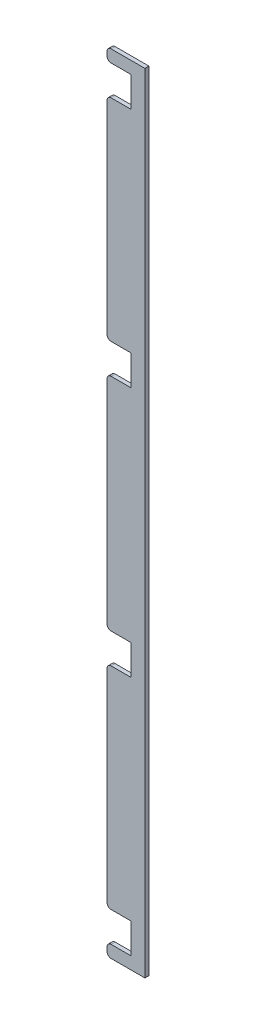
ISO-10303-21;
HEADER;
FILE_DESCRIPTION(('STEP AP214'),'2;1');
FILE_NAME('part.step','',(''),(''),'','','');
FILE_SCHEMA(('AUTOMOTIVE_DESIGN { 1 0 10303 214 1 1 1 1 }'));
ENDSEC;
DATA;
#1=APPLICATION_CONTEXT('core data for automotive mechanical design processes');
#2=APPLICATION_PROTOCOL_DEFINITION('international standard','automotive_design',2000,#1);
#3=PRODUCT_CONTEXT('',#1,'mechanical');
#4=PRODUCT('Part','Part','',(#3));
#5=PRODUCT_RELATED_PRODUCT_CATEGORY('part','',(#4));
#6=PRODUCT_DEFINITION_FORMATION('','',#4);
#7=PRODUCT_DEFINITION_CONTEXT('part definition',#1,'design');
#8=PRODUCT_DEFINITION('design','',#6,#7);
#9=PRODUCT_DEFINITION_SHAPE('','',#8);
#10=(LENGTH_UNIT() NAMED_UNIT(*) SI_UNIT(.MILLI.,.METRE.));
#11=(NAMED_UNIT(*) PLANE_ANGLE_UNIT() SI_UNIT($,.RADIAN.));
#12=(NAMED_UNIT(*) SI_UNIT($,.STERADIAN.) SOLID_ANGLE_UNIT());
#13=UNCERTAINTY_MEASURE_WITH_UNIT(LENGTH_MEASURE(1.E-05),#10,'distance_accuracy_value','');
#14=(GEOMETRIC_REPRESENTATION_CONTEXT(3) GLOBAL_UNCERTAINTY_ASSIGNED_CONTEXT((#13)) GLOBAL_UNIT_ASSIGNED_CONTEXT((#10,
#11,#12)) REPRESENTATION_CONTEXT('',''));
#15=CARTESIAN_POINT('',(0.,0.,0.));
#16=DIRECTION('',(0.,0.,1.));
#17=DIRECTION('',(1.,0.,0.));
#18=AXIS2_PLACEMENT_3D('',#15,#16,#17);
#19=CARTESIAN_POINT('',(-9.40000000000017,0.,1.));
#20=DIRECTION('',(1.,0.,0.));
#21=DIRECTION('',(0.,0.,-1.));
#22=AXIS2_PLACEMENT_3D('',#19,#20,#21);
#23=PLANE('',#22);
#24=DIRECTION('',(0.,-1.,0.));
#25=VECTOR('',#24,1.);
#26=CARTESIAN_POINT('',(-9.40000000000017,0.,0.));
#27=LINE('',#26,#25);
#28=CARTESIAN_POINT('',(-9.40000000000017,12.4047619047619,0.));
#29=VERTEX_POINT('',#28);
#30=CARTESIAN_POINT('',(-9.40000000000017,11.3547619047619,0.));
#31=VERTEX_POINT('',#30);
#32=EDGE_CURVE('E264',#29,#31,#27,.T.);
#33=ORIENTED_EDGE('',*,*,#32,.T.);
#34=DIRECTION('',(0.,0.,-1.));
#35=VECTOR('',#34,1.);
#36=CARTESIAN_POINT('',(-9.40000000000017,11.3547619047619,1.));
#37=LINE('',#36,#35);
#38=CARTESIAN_POINT('',(-9.40000000000017,11.3547619047619,1.));
#39=VERTEX_POINT('',#38);
#40=EDGE_CURVE('E11',#39,#31,#37,.T.);
#41=ORIENTED_EDGE('',*,*,#40,.F.);
#42=DIRECTION('',(0.,-1.,0.));
#43=VECTOR('',#42,1.);
#44=CARTESIAN_POINT('',(-9.40000000000017,0.,1.));
#45=LINE('',#44,#43);
#46=CARTESIAN_POINT('',(-9.40000000000017,12.4047619047619,1.));
#47=VERTEX_POINT('',#46);
#48=EDGE_CURVE('E323',#47,#39,#45,.T.);
#49=ORIENTED_EDGE('',*,*,#48,.F.);
#50=DIRECTION('',(0.,0.,-1.));
#51=VECTOR('',#50,1.);
#52=CARTESIAN_POINT('',(-9.40000000000017,12.4047619047619,1.));
#53=LINE('',#52,#51);
#54=EDGE_CURVE('E263',#47,#29,#53,.T.);
#55=ORIENTED_EDGE('',*,*,#54,.T.);
#56=EDGE_LOOP('',(#33,#41,#49,#55));
#57=FACE_BOUND('',#56,.T.);
#58=ADVANCED_FACE('F35',(#57),#23,.F.);
#59=CARTESIAN_POINT('',(-8.40000000000017,11.3547619047619,1.));
#60=DIRECTION('',(0.,0.,-1.));
#61=DIRECTION('',(-1.,0.,0.));
#62=AXIS2_PLACEMENT_3D('',#59,#60,#61);
#63=CYLINDRICAL_SURFACE('',#62,1.);
#64=CARTESIAN_POINT('',(-8.40000000000017,11.3547619047619,0.));
#65=DIRECTION('',(0.,0.,1.));
#66=DIRECTION('',(1.,0.,0.));
#67=AXIS2_PLACEMENT_3D('',#64,#65,#66);
#68=CIRCLE('',#67,1.);
#69=CARTESIAN_POINT('',(-8.40000000000018,10.3547619047619,0.));
#70=VERTEX_POINT('',#69);
#71=EDGE_CURVE('E267',#31,#70,#68,.T.);
#72=ORIENTED_EDGE('',*,*,#71,.T.);
#73=DIRECTION('',(0.,0.,-1.));
#74=VECTOR('',#73,1.);
#75=CARTESIAN_POINT('',(-8.40000000000018,10.3547619047619,1.));
#76=LINE('',#75,#74);
#77=CARTESIAN_POINT('',(-8.40000000000018,10.3547619047619,1.));
#78=VERTEX_POINT('',#77);
#79=EDGE_CURVE('E43',#78,#70,#76,.T.);
#80=ORIENTED_EDGE('',*,*,#79,.F.);
#81=CARTESIAN_POINT('',(-8.40000000000017,11.3547619047619,1.));
#82=DIRECTION('',(0.,0.,1.));
#83=DIRECTION('',(1.,0.,0.));
#84=AXIS2_PLACEMENT_3D('',#81,#82,#83);
#85=CIRCLE('',#84,1.);
#86=EDGE_CURVE('E159',#39,#78,#85,.T.);
#87=ORIENTED_EDGE('',*,*,#86,.F.);
#88=ORIENTED_EDGE('',*,*,#40,.T.);
#89=EDGE_LOOP('',(#72,#80,#87,#88));
#90=FACE_BOUND('',#89,.T.);
#91=ADVANCED_FACE('F489',(#90),#63,.T.);
#92=CARTESIAN_POINT('',(0.,10.3547619047619,1.));
#93=DIRECTION('',(0.,1.,0.));
#94=DIRECTION('',(-1.,0.,0.));
#95=AXIS2_PLACEMENT_3D('',#92,#93,#94);
#96=PLANE('',#95);
#97=DIRECTION('',(1.,0.,0.));
#98=VECTOR('',#97,1.);
#99=CARTESIAN_POINT('',(0.,10.3547619047619,0.));
#100=LINE('',#99,#98);
#101=CARTESIAN_POINT('',(-3.50000000000004,10.3547619047619,0.));
#102=VERTEX_POINT('',#101);
#103=EDGE_CURVE('E269',#70,#102,#100,.T.);
#104=ORIENTED_EDGE('',*,*,#103,.T.);
#105=DIRECTION('',(0.,0.,-1.));
#106=VECTOR('',#105,1.);
#107=CARTESIAN_POINT('',(-3.50000000000004,10.3547619047619,1.));
#108=LINE('',#107,#106);
#109=CARTESIAN_POINT('',(-3.50000000000004,10.3547619047619,1.));
#110=VERTEX_POINT('',#109);
#111=EDGE_CURVE('E396',#110,#102,#108,.T.);
#112=ORIENTED_EDGE('',*,*,#111,.F.);
#113=DIRECTION('',(1.,0.,0.));
#114=VECTOR('',#113,1.);
#115=CARTESIAN_POINT('',(0.,10.3547619047619,1.));
#116=LINE('',#115,#114);
#117=EDGE_CURVE('E404',#78,#110,#116,.T.);
#118=ORIENTED_EDGE('',*,*,#117,.F.);
#119=ORIENTED_EDGE('',*,*,#79,.T.);
#120=EDGE_LOOP('',(#104,#112,#118,#119));
#121=FACE_BOUND('',#120,.T.);
#122=ADVANCED_FACE('F402',(#121),#96,.F.);
#123=CARTESIAN_POINT('',(-3.50000000000004,0.,1.));
#124=DIRECTION('',(1.,0.,0.));
#125=DIRECTION('',(0.,1.,0.));
#126=AXIS2_PLACEMENT_3D('',#123,#124,#125);
#127=PLANE('',#126);
#128=DIRECTION('',(0.,-1.,0.));
#129=VECTOR('',#128,1.);
#130=CARTESIAN_POINT('',(-3.50000000000004,0.,0.));
#131=LINE('',#130,#129);
#132=CARTESIAN_POINT('',(-3.50000000000004,2.85476190476189,0.));
#133=VERTEX_POINT('',#132);
#134=EDGE_CURVE('E271',#102,#133,#131,.T.);
#135=ORIENTED_EDGE('',*,*,#134,.T.);
#136=DIRECTION('',(0.,0.,-1.));
#137=VECTOR('',#136,1.);
#138=CARTESIAN_POINT('',(-3.50000000000004,2.85476190476189,1.));
#139=LINE('',#138,#137);
#140=CARTESIAN_POINT('',(-3.50000000000004,2.85476190476189,1.));
#141=VERTEX_POINT('',#140);
#142=EDGE_CURVE('E393',#141,#133,#139,.T.);
#143=ORIENTED_EDGE('',*,*,#142,.F.);
#144=DIRECTION('',(0.,-1.,0.));
#145=VECTOR('',#144,1.);
#146=CARTESIAN_POINT('',(-3.50000000000004,0.,1.));
#147=LINE('',#146,#145);
#148=EDGE_CURVE('E422',#110,#141,#147,.T.);
#149=ORIENTED_EDGE('',*,*,#148,.F.);
#150=ORIENTED_EDGE('',*,*,#111,.T.);
#151=EDGE_LOOP('',(#135,#143,#149,#150));
#152=FACE_BOUND('',#151,.T.);
#153=ADVANCED_FACE('F413',(#152),#127,.F.);
#154=CARTESIAN_POINT('',(0.,2.85476190476194,1.));
#155=DIRECTION('',(0.,-1.,0.));
#156=DIRECTION('',(1.,0.,0.));
#157=AXIS2_PLACEMENT_3D('',#154,#155,#156);
#158=PLANE('',#157);
#159=DIRECTION('',(-1.,0.,0.));
#160=VECTOR('',#159,1.);
#161=CARTESIAN_POINT('',(0.,2.85476190476194,0.));
#162=LINE('',#161,#160);
#163=CARTESIAN_POINT('',(-8.40000000000016,2.85476190476189,0.));
#164=VERTEX_POINT('',#163);
#165=EDGE_CURVE('E273',#133,#164,#162,.T.);
#166=ORIENTED_EDGE('',*,*,#165,.T.);
#167=DIRECTION('',(0.,0.,-1.));
#168=VECTOR('',#167,1.);
#169=CARTESIAN_POINT('',(-8.40000000000016,2.85476190476189,1.));
#170=LINE('',#169,#168);
#171=CARTESIAN_POINT('',(-8.40000000000016,2.85476190476189,1.));
#172=VERTEX_POINT('',#171);
#173=EDGE_CURVE('E390',#172,#164,#170,.T.);
#174=ORIENTED_EDGE('',*,*,#173,.F.);
#175=DIRECTION('',(-1.,0.,0.));
#176=VECTOR('',#175,1.);
#177=CARTESIAN_POINT('',(0.,2.85476190476194,1.));
#178=LINE('',#177,#176);
#179=EDGE_CURVE('E419',#141,#172,#178,.T.);
#180=ORIENTED_EDGE('',*,*,#179,.F.);
#181=ORIENTED_EDGE('',*,*,#142,.T.);
#182=EDGE_LOOP('',(#166,#174,#180,#181));
#183=FACE_BOUND('',#182,.T.);
#184=ADVANCED_FACE('F417',(#183),#158,.F.);
#185=CARTESIAN_POINT('',(-8.40000000000017,1.85476190476189,1.));
#186=DIRECTION('',(0.,0.,-1.));
#187=DIRECTION('',(-1.,0.,0.));
#188=AXIS2_PLACEMENT_3D('',#185,#186,#187);
#189=CYLINDRICAL_SURFACE('',#188,1.);
#190=CARTESIAN_POINT('',(-8.40000000000017,1.85476190476189,0.));
#191=DIRECTION('',(0.,0.,1.));
#192=DIRECTION('',(1.,0.,0.));
#193=AXIS2_PLACEMENT_3D('',#190,#191,#192);
#194=CIRCLE('',#193,1.);
#195=CARTESIAN_POINT('',(-9.40000000000017,1.85476190476189,0.));
#196=VERTEX_POINT('',#195);
#197=EDGE_CURVE('E275',#164,#196,#194,.T.);
#198=ORIENTED_EDGE('',*,*,#197,.T.);
#199=DIRECTION('',(0.,0.,-1.));
#200=VECTOR('',#199,1.);
#201=CARTESIAN_POINT('',(-9.40000000000017,1.85476190476189,1.));
#202=LINE('',#201,#200);
#203=CARTESIAN_POINT('',(-9.40000000000017,1.85476190476189,1.));
#204=VERTEX_POINT('',#203);
#205=EDGE_CURVE('E387',#204,#196,#202,.T.);
#206=ORIENTED_EDGE('',*,*,#205,.F.);
#207=CARTESIAN_POINT('',(-8.40000000000017,1.85476190476189,1.));
#208=DIRECTION('',(0.,0.,1.));
#209=DIRECTION('',(1.,0.,0.));
#210=AXIS2_PLACEMENT_3D('',#207,#208,#209);
#211=CIRCLE('',#210,1.);
#212=EDGE_CURVE('E421',#172,#204,#211,.T.);
#213=ORIENTED_EDGE('',*,*,#212,.F.);
#214=ORIENTED_EDGE('',*,*,#173,.T.);
#215=EDGE_LOOP('',(#198,#206,#213,#214));
#216=FACE_BOUND('',#215,.T.);
#217=ADVANCED_FACE('F502',(#216),#189,.T.);
#218=CARTESIAN_POINT('',(-9.40000000000017,0.,1.));
#219=DIRECTION('',(1.,0.,0.));
#220=DIRECTION('',(0.,0.,-1.));
#221=AXIS2_PLACEMENT_3D('',#218,#219,#220);
#222=PLANE('',#221);
#223=DIRECTION('',(0.,-1.,0.));
#224=VECTOR('',#223,1.);
#225=CARTESIAN_POINT('',(-9.40000000000017,0.,0.));
#226=LINE('',#225,#224);
#227=CARTESIAN_POINT('',(-9.40000000000017,-48.6452380952381,0.));
#228=VERTEX_POINT('',#227);
#229=EDGE_CURVE('E277',#196,#228,#226,.T.);
#230=ORIENTED_EDGE('',*,*,#229,.T.);
#231=DIRECTION('',(0.,0.,-1.));
#232=VECTOR('',#231,1.);
#233=CARTESIAN_POINT('',(-9.40000000000017,-48.6452380952381,1.));
#234=LINE('',#233,#232);
#235=CARTESIAN_POINT('',(-9.40000000000017,-48.6452380952381,1.));
#236=VERTEX_POINT('',#235);
#237=EDGE_CURVE('E384',#236,#228,#234,.T.);
#238=ORIENTED_EDGE('',*,*,#237,.F.);
#239=DIRECTION('',(0.,-1.,0.));
#240=VECTOR('',#239,1.);
#241=CARTESIAN_POINT('',(-9.40000000000017,0.,1.));
#242=LINE('',#241,#240);
#243=EDGE_CURVE('E424',#204,#236,#242,.T.);
#244=ORIENTED_EDGE('',*,*,#243,.F.);
#245=ORIENTED_EDGE('',*,*,#205,.T.);
#246=EDGE_LOOP('',(#230,#238,#244,#245));
#247=FACE_BOUND('',#246,.T.);
#248=ADVANCED_FACE('F505',(#247),#222,.F.);
#249=CARTESIAN_POINT('',(-8.40000000000017,-48.6452380952381,1.));
#250=DIRECTION('',(0.,0.,-1.));
#251=DIRECTION('',(-1.,0.,0.));
#252=AXIS2_PLACEMENT_3D('',#249,#250,#251);
#253=CYLINDRICAL_SURFACE('',#252,1.);
#254=CARTESIAN_POINT('',(-8.40000000000017,-48.6452380952381,0.));
#255=DIRECTION('',(0.,0.,1.));
#256=DIRECTION('',(1.,0.,0.));
#257=AXIS2_PLACEMENT_3D('',#254,#255,#256);
#258=CIRCLE('',#257,1.);
#259=CARTESIAN_POINT('',(-8.40000000000018,-49.6452380952381,0.));
#260=VERTEX_POINT('',#259);
#261=EDGE_CURVE('E279',#228,#260,#258,.T.);
#262=ORIENTED_EDGE('',*,*,#261,.T.);
#263=DIRECTION('',(0.,0.,-1.));
#264=VECTOR('',#263,1.);
#265=CARTESIAN_POINT('',(-8.40000000000018,-49.6452380952381,1.));
#266=LINE('',#265,#264);
#267=CARTESIAN_POINT('',(-8.40000000000018,-49.6452380952381,1.));
#268=VERTEX_POINT('',#267);
#269=EDGE_CURVE('E381',#268,#260,#266,.T.);
#270=ORIENTED_EDGE('',*,*,#269,.F.);
#271=CARTESIAN_POINT('',(-8.40000000000017,-48.6452380952381,1.));
#272=DIRECTION('',(0.,0.,1.));
#273=DIRECTION('',(1.,0.,0.));
#274=AXIS2_PLACEMENT_3D('',#271,#272,#273);
#275=CIRCLE('',#274,1.);
#276=EDGE_CURVE('E430',#236,#268,#275,.T.);
#277=ORIENTED_EDGE('',*,*,#276,.F.);
#278=ORIENTED_EDGE('',*,*,#237,.T.);
#279=EDGE_LOOP('',(#262,#270,#277,#278));
#280=FACE_BOUND('',#279,.T.);
#281=ADVANCED_FACE('F509',(#280),#253,.T.);
#282=CARTESIAN_POINT('',(0.,-49.6452380952381,1.));
#283=DIRECTION('',(0.,1.,0.));
#284=DIRECTION('',(-1.,0.,0.));
#285=AXIS2_PLACEMENT_3D('',#282,#283,#284);
#286=PLANE('',#285);
#287=DIRECTION('',(1.,0.,0.));
#288=VECTOR('',#287,1.);
#289=CARTESIAN_POINT('',(0.,-49.6452380952381,0.));
#290=LINE('',#289,#288);
#291=CARTESIAN_POINT('',(-3.50000000000003,-49.6452380952381,0.));
#292=VERTEX_POINT('',#291);
#293=EDGE_CURVE('E281',#260,#292,#290,.T.);
#294=ORIENTED_EDGE('',*,*,#293,.T.);
#295=DIRECTION('',(0.,0.,-1.));
#296=VECTOR('',#295,1.);
#297=CARTESIAN_POINT('',(-3.50000000000003,-49.6452380952381,1.));
#298=LINE('',#297,#296);
#299=CARTESIAN_POINT('',(-3.50000000000003,-49.6452380952381,1.));
#300=VERTEX_POINT('',#299);
#301=EDGE_CURVE('E378',#300,#292,#298,.T.);
#302=ORIENTED_EDGE('',*,*,#301,.F.);
#303=DIRECTION('',(1.,0.,0.));
#304=VECTOR('',#303,1.);
#305=CARTESIAN_POINT('',(0.,-49.6452380952381,1.));
#306=LINE('',#305,#304);
#307=EDGE_CURVE('E432',#268,#300,#306,.T.);
#308=ORIENTED_EDGE('',*,*,#307,.F.);
#309=ORIENTED_EDGE('',*,*,#269,.T.);
#310=EDGE_LOOP('',(#294,#302,#308,#309));
#311=FACE_BOUND('',#310,.T.);
#312=ADVANCED_FACE('F513',(#311),#286,.F.);
#313=CARTESIAN_POINT('',(-3.50000000000004,0.,1.));
#314=DIRECTION('',(1.,0.,0.));
#315=DIRECTION('',(0.,1.,0.));
#316=AXIS2_PLACEMENT_3D('',#313,#314,#315);
#317=PLANE('',#316);
#318=DIRECTION('',(0.,-1.,0.));
#319=VECTOR('',#318,1.);
#320=CARTESIAN_POINT('',(-3.50000000000004,0.,0.));
#321=LINE('',#320,#319);
#322=CARTESIAN_POINT('',(-3.50000000000003,-57.1452380952381,0.));
#323=VERTEX_POINT('',#322);
#324=EDGE_CURVE('E283',#292,#323,#321,.T.);
#325=ORIENTED_EDGE('',*,*,#324,.T.);
#326=DIRECTION('',(0.,0.,-1.));
#327=VECTOR('',#326,1.);
#328=CARTESIAN_POINT('',(-3.50000000000003,-57.1452380952381,1.));
#329=LINE('',#328,#327);
#330=CARTESIAN_POINT('',(-3.50000000000003,-57.1452380952381,1.));
#331=VERTEX_POINT('',#330);
#332=EDGE_CURVE('E375',#331,#323,#329,.T.);
#333=ORIENTED_EDGE('',*,*,#332,.F.);
#334=DIRECTION('',(0.,-1.,0.));
#335=VECTOR('',#334,1.);
#336=CARTESIAN_POINT('',(-3.50000000000004,0.,1.));
#337=LINE('',#336,#335);
#338=EDGE_CURVE('E434',#300,#331,#337,.T.);
#339=ORIENTED_EDGE('',*,*,#338,.F.);
#340=ORIENTED_EDGE('',*,*,#301,.T.);
#341=EDGE_LOOP('',(#325,#333,#339,#340));
#342=FACE_BOUND('',#341,.T.);
#343=ADVANCED_FACE('F517',(#342),#317,.F.);
#344=CARTESIAN_POINT('',(3.96524744256675E-13,-57.1452380952381,1.));
#345=DIRECTION('',(0.,-1.,0.));
#346=DIRECTION('',(1.,0.,0.));
#347=AXIS2_PLACEMENT_3D('',#344,#345,#346);
#348=PLANE('',#347);
#349=DIRECTION('',(-1.,0.,0.));
#350=VECTOR('',#349,1.);
#351=CARTESIAN_POINT('',(3.96524744256675E-13,-57.1452380952381,0.));
#352=LINE('',#351,#350);
#353=CARTESIAN_POINT('',(-8.40000000000016,-57.1452380952381,0.));
#354=VERTEX_POINT('',#353);
#355=EDGE_CURVE('E285',#323,#354,#352,.T.);
#356=ORIENTED_EDGE('',*,*,#355,.T.);
#357=DIRECTION('',(0.,0.,-1.));
#358=VECTOR('',#357,1.);
#359=CARTESIAN_POINT('',(-8.40000000000016,-57.1452380952381,1.));
#360=LINE('',#359,#358);
#361=CARTESIAN_POINT('',(-8.40000000000016,-57.1452380952381,1.));
#362=VERTEX_POINT('',#361);
#363=EDGE_CURVE('E372',#362,#354,#360,.T.);
#364=ORIENTED_EDGE('',*,*,#363,.F.);
#365=DIRECTION('',(-1.,0.,0.));
#366=VECTOR('',#365,1.);
#367=CARTESIAN_POINT('',(3.96524744256675E-13,-57.1452380952381,1.));
#368=LINE('',#367,#366);
#369=EDGE_CURVE('E436',#331,#362,#368,.T.);
#370=ORIENTED_EDGE('',*,*,#369,.F.);
#371=ORIENTED_EDGE('',*,*,#332,.T.);
#372=EDGE_LOOP('',(#356,#364,#370,#371));
#373=FACE_BOUND('',#372,.T.);
#374=ADVANCED_FACE('F521',(#373),#348,.F.);
#375=CARTESIAN_POINT('',(-8.40000000000017,-58.1452380952381,1.));
#376=DIRECTION('',(0.,0.,-1.));
#377=DIRECTION('',(-1.,0.,0.));
#378=AXIS2_PLACEMENT_3D('',#375,#376,#377);
#379=CYLINDRICAL_SURFACE('',#378,1.);
#380=CARTESIAN_POINT('',(-8.40000000000017,-58.1452380952381,0.));
#381=DIRECTION('',(0.,0.,1.));
#382=DIRECTION('',(1.,0.,0.));
#383=AXIS2_PLACEMENT_3D('',#380,#381,#382);
#384=CIRCLE('',#383,1.);
#385=CARTESIAN_POINT('',(-9.40000000000017,-58.1452380952381,0.));
#386=VERTEX_POINT('',#385);
#387=EDGE_CURVE('E287',#354,#386,#384,.T.);
#388=ORIENTED_EDGE('',*,*,#387,.T.);
#389=DIRECTION('',(0.,0.,-1.));
#390=VECTOR('',#389,1.);
#391=CARTESIAN_POINT('',(-9.40000000000017,-58.1452380952381,1.));
#392=LINE('',#391,#390);
#393=CARTESIAN_POINT('',(-9.40000000000017,-58.1452380952381,1.));
#394=VERTEX_POINT('',#393);
#395=EDGE_CURVE('E369',#394,#386,#392,.T.);
#396=ORIENTED_EDGE('',*,*,#395,.F.);
#397=CARTESIAN_POINT('',(-8.40000000000017,-58.1452380952381,1.));
#398=DIRECTION('',(0.,0.,1.));
#399=DIRECTION('',(1.,0.,0.));
#400=AXIS2_PLACEMENT_3D('',#397,#398,#399);
#401=CIRCLE('',#400,1.);
#402=EDGE_CURVE('E438',#362,#394,#401,.T.);
#403=ORIENTED_EDGE('',*,*,#402,.F.);
#404=ORIENTED_EDGE('',*,*,#363,.T.);
#405=EDGE_LOOP('',(#388,#396,#403,#404));
#406=FACE_BOUND('',#405,.T.);
#407=ADVANCED_FACE('F525',(#406),#379,.T.);
#408=CARTESIAN_POINT('',(-9.40000000000017,0.,1.));
#409=DIRECTION('',(1.,0.,0.));
#410=DIRECTION('',(0.,0.,-1.));
#411=AXIS2_PLACEMENT_3D('',#408,#409,#410);
#412=PLANE('',#411);
#413=DIRECTION('',(0.,-1.,0.));
#414=VECTOR('',#413,1.);
#415=CARTESIAN_POINT('',(-9.40000000000017,0.,0.));
#416=LINE('',#415,#414);
#417=CARTESIAN_POINT('',(-9.40000000000017,-111.045238095238,0.));
#418=VERTEX_POINT('',#417);
#419=EDGE_CURVE('E289',#386,#418,#416,.T.);
#420=ORIENTED_EDGE('',*,*,#419,.T.);
#421=DIRECTION('',(0.,0.,-1.));
#422=VECTOR('',#421,1.);
#423=CARTESIAN_POINT('',(-9.40000000000017,-111.045238095238,1.));
#424=LINE('',#423,#422);
#425=CARTESIAN_POINT('',(-9.40000000000017,-111.045238095238,1.));
#426=VERTEX_POINT('',#425);
#427=EDGE_CURVE('E366',#426,#418,#424,.T.);
#428=ORIENTED_EDGE('',*,*,#427,.F.);
#429=DIRECTION('',(0.,-1.,0.));
#430=VECTOR('',#429,1.);
#431=CARTESIAN_POINT('',(-9.40000000000017,0.,1.));
#432=LINE('',#431,#430);
#433=EDGE_CURVE('E440',#394,#426,#432,.T.);
#434=ORIENTED_EDGE('',*,*,#433,.F.);
#435=ORIENTED_EDGE('',*,*,#395,.T.);
#436=EDGE_LOOP('',(#420,#428,#434,#435));
#437=FACE_BOUND('',#436,.T.);
#438=ADVANCED_FACE('F529',(#437),#412,.F.);
#439=CARTESIAN_POINT('',(-8.40000000000017,-111.045238095238,1.));
#440=DIRECTION('',(0.,0.,-1.));
#441=DIRECTION('',(-1.,0.,0.));
#442=AXIS2_PLACEMENT_3D('',#439,#440,#441);
#443=CYLINDRICAL_SURFACE('',#442,1.);
#444=CARTESIAN_POINT('',(-8.40000000000017,-111.045238095238,0.));
#445=DIRECTION('',(0.,0.,1.));
#446=DIRECTION('',(1.,0.,0.));
#447=AXIS2_PLACEMENT_3D('',#444,#445,#446);
#448=CIRCLE('',#447,1.);
#449=CARTESIAN_POINT('',(-8.40000000000017,-112.045238095238,0.));
#450=VERTEX_POINT('',#449);
#451=EDGE_CURVE('E291',#418,#450,#448,.T.);
#452=ORIENTED_EDGE('',*,*,#451,.T.);
#453=DIRECTION('',(0.,0.,-1.));
#454=VECTOR('',#453,1.);
#455=CARTESIAN_POINT('',(-8.40000000000017,-112.045238095238,1.));
#456=LINE('',#455,#454);
#457=CARTESIAN_POINT('',(-8.40000000000017,-112.045238095238,1.));
#458=VERTEX_POINT('',#457);
#459=EDGE_CURVE('E363',#458,#450,#456,.T.);
#460=ORIENTED_EDGE('',*,*,#459,.F.);
#461=CARTESIAN_POINT('',(-8.40000000000017,-111.045238095238,1.));
#462=DIRECTION('',(0.,0.,1.));
#463=DIRECTION('',(1.,0.,0.));
#464=AXIS2_PLACEMENT_3D('',#461,#462,#463);
#465=CIRCLE('',#464,1.);
#466=EDGE_CURVE('E442',#426,#458,#465,.T.);
#467=ORIENTED_EDGE('',*,*,#466,.F.);
#468=ORIENTED_EDGE('',*,*,#427,.T.);
#469=EDGE_LOOP('',(#452,#460,#467,#468));
#470=FACE_BOUND('',#469,.T.);
#471=ADVANCED_FACE('F533',(#470),#443,.T.);
#472=CARTESIAN_POINT('',(3.98702574143949E-13,-112.045238095238,1.));
#473=DIRECTION('',(0.,1.,0.));
#474=DIRECTION('',(-1.,0.,0.));
#475=AXIS2_PLACEMENT_3D('',#472,#473,#474);
#476=PLANE('',#475);
#477=DIRECTION('',(1.,0.,0.));
#478=VECTOR('',#477,1.);
#479=CARTESIAN_POINT('',(3.98702574143949E-13,-112.045238095238,0.));
#480=LINE('',#479,#478);
#481=CARTESIAN_POINT('',(-3.50000000000003,-112.045238095238,0.));
#482=VERTEX_POINT('',#481);
#483=EDGE_CURVE('E293',#450,#482,#480,.T.);
#484=ORIENTED_EDGE('',*,*,#483,.T.);
#485=DIRECTION('',(0.,0.,-1.));
#486=VECTOR('',#485,1.);
#487=CARTESIAN_POINT('',(-3.50000000000003,-112.045238095238,1.));
#488=LINE('',#487,#486);
#489=CARTESIAN_POINT('',(-3.50000000000003,-112.045238095238,1.));
#490=VERTEX_POINT('',#489);
#491=EDGE_CURVE('E360',#490,#482,#488,.T.);
#492=ORIENTED_EDGE('',*,*,#491,.F.);
#493=DIRECTION('',(1.,0.,0.));
#494=VECTOR('',#493,1.);
#495=CARTESIAN_POINT('',(3.98702574143949E-13,-112.045238095238,1.));
#496=LINE('',#495,#494);
#497=EDGE_CURVE('E444',#458,#490,#496,.T.);
#498=ORIENTED_EDGE('',*,*,#497,.F.);
#499=ORIENTED_EDGE('',*,*,#459,.T.);
#500=EDGE_LOOP('',(#484,#492,#498,#499));
#501=FACE_BOUND('',#500,.T.);
#502=ADVANCED_FACE('F537',(#501),#476,.F.);
#503=CARTESIAN_POINT('',(-3.50000000000004,0.,1.));
#504=DIRECTION('',(1.,0.,0.));
#505=DIRECTION('',(0.,1.,0.));
#506=AXIS2_PLACEMENT_3D('',#503,#504,#505);
#507=PLANE('',#506);
#508=DIRECTION('',(0.,-1.,0.));
#509=VECTOR('',#508,1.);
#510=CARTESIAN_POINT('',(-3.50000000000004,0.,0.));
#511=LINE('',#510,#509);
#512=CARTESIAN_POINT('',(-3.50000000000002,-119.545238095238,0.));
#513=VERTEX_POINT('',#512);
#514=EDGE_CURVE('E295',#482,#513,#511,.T.);
#515=ORIENTED_EDGE('',*,*,#514,.T.);
#516=DIRECTION('',(0.,0.,-1.));
#517=VECTOR('',#516,1.);
#518=CARTESIAN_POINT('',(-3.50000000000002,-119.545238095238,1.));
#519=LINE('',#518,#517);
#520=CARTESIAN_POINT('',(-3.50000000000002,-119.545238095238,1.));
#521=VERTEX_POINT('',#520);
#522=EDGE_CURVE('E357',#521,#513,#519,.T.);
#523=ORIENTED_EDGE('',*,*,#522,.F.);
#524=DIRECTION('',(0.,-1.,0.));
#525=VECTOR('',#524,1.);
#526=CARTESIAN_POINT('',(-3.50000000000004,0.,1.));
#527=LINE('',#526,#525);
#528=EDGE_CURVE('E446',#490,#521,#527,.T.);
#529=ORIENTED_EDGE('',*,*,#528,.F.);
#530=ORIENTED_EDGE('',*,*,#491,.T.);
#531=EDGE_LOOP('',(#515,#523,#529,#530));
#532=FACE_BOUND('',#531,.T.);
#533=ADVANCED_FACE('F541',(#532),#507,.F.);
#534=CARTESIAN_POINT('',(0.,-119.545238095238,1.));
#535=DIRECTION('',(0.,-1.,0.));
#536=DIRECTION('',(0.,0.,-1.));
#537=AXIS2_PLACEMENT_3D('',#534,#535,#536);
#538=PLANE('',#537);
#539=DIRECTION('',(-1.,0.,0.));
#540=VECTOR('',#539,1.);
#541=CARTESIAN_POINT('',(0.,-119.545238095238,0.));
#542=LINE('',#541,#540);
#543=CARTESIAN_POINT('',(-8.40000000000017,-119.545238095238,0.));
#544=VERTEX_POINT('',#543);
#545=EDGE_CURVE('E297',#513,#544,#542,.T.);
#546=ORIENTED_EDGE('',*,*,#545,.T.);
#547=DIRECTION('',(0.,0.,-1.));
#548=VECTOR('',#547,1.);
#549=CARTESIAN_POINT('',(-8.40000000000017,-119.545238095238,1.));
#550=LINE('',#549,#548);
#551=CARTESIAN_POINT('',(-8.40000000000017,-119.545238095238,1.));
#552=VERTEX_POINT('',#551);
#553=EDGE_CURVE('E354',#552,#544,#550,.T.);
#554=ORIENTED_EDGE('',*,*,#553,.F.);
#555=DIRECTION('',(-1.,0.,0.));
#556=VECTOR('',#555,1.);
#557=CARTESIAN_POINT('',(0.,-119.545238095238,1.));
#558=LINE('',#557,#556);
#559=EDGE_CURVE('E448',#521,#552,#558,.T.);
#560=ORIENTED_EDGE('',*,*,#559,.F.);
#561=ORIENTED_EDGE('',*,*,#522,.T.);
#562=EDGE_LOOP('',(#546,#554,#560,#561));
#563=FACE_BOUND('',#562,.T.);
#564=ADVANCED_FACE('F545',(#563),#538,.F.);
#565=CARTESIAN_POINT('',(-8.40000000000017,-120.545238095238,1.));
#566=DIRECTION('',(0.,0.,-1.));
#567=DIRECTION('',(-1.,0.,0.));
#568=AXIS2_PLACEMENT_3D('',#565,#566,#567);
#569=CYLINDRICAL_SURFACE('',#568,1.);
#570=CARTESIAN_POINT('',(-8.40000000000017,-120.545238095238,0.));
#571=DIRECTION('',(0.,0.,1.));
#572=DIRECTION('',(1.,0.,0.));
#573=AXIS2_PLACEMENT_3D('',#570,#571,#572);
#574=CIRCLE('',#573,1.);
#575=CARTESIAN_POINT('',(-9.40000000000017,-120.545238095238,0.));
#576=VERTEX_POINT('',#575);
#577=EDGE_CURVE('E299',#544,#576,#574,.T.);
#578=ORIENTED_EDGE('',*,*,#577,.T.);
#579=DIRECTION('',(0.,0.,-1.));
#580=VECTOR('',#579,1.);
#581=CARTESIAN_POINT('',(-9.40000000000017,-120.545238095238,1.));
#582=LINE('',#581,#580);
#583=CARTESIAN_POINT('',(-9.40000000000017,-120.545238095238,1.));
#584=VERTEX_POINT('',#583);
#585=EDGE_CURVE('E351',#584,#576,#582,.T.);
#586=ORIENTED_EDGE('',*,*,#585,.F.);
#587=CARTESIAN_POINT('',(-8.40000000000017,-120.545238095238,1.));
#588=DIRECTION('',(0.,0.,1.));
#589=DIRECTION('',(1.,0.,0.));
#590=AXIS2_PLACEMENT_3D('',#587,#588,#589);
#591=CIRCLE('',#590,1.);
#592=EDGE_CURVE('E450',#552,#584,#591,.T.);
#593=ORIENTED_EDGE('',*,*,#592,.F.);
#594=ORIENTED_EDGE('',*,*,#553,.T.);
#595=EDGE_LOOP('',(#578,#586,#593,#594));
#596=FACE_BOUND('',#595,.T.);
#597=ADVANCED_FACE('F549',(#596),#569,.T.);
#598=CARTESIAN_POINT('',(-9.40000000000017,0.,1.));
#599=DIRECTION('',(1.,0.,0.));
#600=DIRECTION('',(0.,0.,-1.));
#601=AXIS2_PLACEMENT_3D('',#598,#599,#600);
#602=PLANE('',#601);
#603=DIRECTION('',(0.,-1.,0.));
#604=VECTOR('',#603,1.);
#605=CARTESIAN_POINT('',(-9.40000000000017,0.,0.));
#606=LINE('',#605,#604);
#607=CARTESIAN_POINT('',(-9.40000000000017,-171.045238095238,0.));
#608=VERTEX_POINT('',#607);
#609=EDGE_CURVE('E301',#576,#608,#606,.T.);
#610=ORIENTED_EDGE('',*,*,#609,.T.);
#611=DIRECTION('',(0.,0.,-1.));
#612=VECTOR('',#611,1.);
#613=CARTESIAN_POINT('',(-9.40000000000017,-171.045238095238,1.));
#614=LINE('',#613,#612);
#615=CARTESIAN_POINT('',(-9.40000000000017,-171.045238095238,1.));
#616=VERTEX_POINT('',#615);
#617=EDGE_CURVE('E348',#616,#608,#614,.T.);
#618=ORIENTED_EDGE('',*,*,#617,.F.);
#619=DIRECTION('',(0.,-1.,0.));
#620=VECTOR('',#619,1.);
#621=CARTESIAN_POINT('',(-9.40000000000017,0.,1.));
#622=LINE('',#621,#620);
#623=EDGE_CURVE('E452',#584,#616,#622,.T.);
#624=ORIENTED_EDGE('',*,*,#623,.F.);
#625=ORIENTED_EDGE('',*,*,#585,.T.);
#626=EDGE_LOOP('',(#610,#618,#624,#625));
#627=FACE_BOUND('',#626,.T.);
#628=ADVANCED_FACE('F553',(#627),#602,.F.);
#629=CARTESIAN_POINT('',(-8.40000000000017,-171.045238095238,1.));
#630=DIRECTION('',(0.,0.,-1.));
#631=DIRECTION('',(-1.,0.,0.));
#632=AXIS2_PLACEMENT_3D('',#629,#630,#631);
#633=CYLINDRICAL_SURFACE('',#632,1.);
#634=CARTESIAN_POINT('',(-8.40000000000017,-171.045238095238,0.));
#635=DIRECTION('',(0.,0.,1.));
#636=DIRECTION('',(1.,0.,0.));
#637=AXIS2_PLACEMENT_3D('',#634,#635,#636);
#638=CIRCLE('',#637,1.);
#639=CARTESIAN_POINT('',(-8.40000000000017,-172.045238095238,0.));
#640=VERTEX_POINT('',#639);
#641=EDGE_CURVE('E303',#608,#640,#638,.T.);
#642=ORIENTED_EDGE('',*,*,#641,.T.);
#643=DIRECTION('',(0.,0.,-1.));
#644=VECTOR('',#643,1.);
#645=CARTESIAN_POINT('',(-8.40000000000017,-172.045238095238,1.));
#646=LINE('',#645,#644);
#647=CARTESIAN_POINT('',(-8.40000000000017,-172.045238095238,1.));
#648=VERTEX_POINT('',#647);
#649=EDGE_CURVE('E345',#648,#640,#646,.T.);
#650=ORIENTED_EDGE('',*,*,#649,.F.);
#651=CARTESIAN_POINT('',(-8.40000000000017,-171.045238095238,1.));
#652=DIRECTION('',(0.,0.,1.));
#653=DIRECTION('',(1.,0.,0.));
#654=AXIS2_PLACEMENT_3D('',#651,#652,#653);
#655=CIRCLE('',#654,1.);
#656=EDGE_CURVE('E454',#616,#648,#655,.T.);
#657=ORIENTED_EDGE('',*,*,#656,.F.);
#658=ORIENTED_EDGE('',*,*,#617,.T.);
#659=EDGE_LOOP('',(#642,#650,#657,#658));
#660=FACE_BOUND('',#659,.T.);
#661=ADVANCED_FACE('F557',(#660),#633,.T.);
#662=CARTESIAN_POINT('',(0.,-172.045238095238,1.));
#663=DIRECTION('',(0.,1.,0.));
#664=DIRECTION('',(0.,0.,1.));
#665=AXIS2_PLACEMENT_3D('',#662,#663,#664);
#666=PLANE('',#665);
#667=DIRECTION('',(1.,0.,0.));
#668=VECTOR('',#667,1.);
#669=CARTESIAN_POINT('',(0.,-172.045238095238,0.));
#670=LINE('',#669,#668);
#671=CARTESIAN_POINT('',(-3.50000000000002,-172.045238095238,0.));
#672=VERTEX_POINT('',#671);
#673=EDGE_CURVE('E305',#640,#672,#670,.T.);
#674=ORIENTED_EDGE('',*,*,#673,.T.);
#675=DIRECTION('',(0.,0.,-1.));
#676=VECTOR('',#675,1.);
#677=CARTESIAN_POINT('',(-3.50000000000002,-172.045238095238,1.));
#678=LINE('',#677,#676);
#679=CARTESIAN_POINT('',(-3.50000000000002,-172.045238095238,1.));
#680=VERTEX_POINT('',#679);
#681=EDGE_CURVE('E342',#680,#672,#678,.T.);
#682=ORIENTED_EDGE('',*,*,#681,.F.);
#683=DIRECTION('',(1.,0.,0.));
#684=VECTOR('',#683,1.);
#685=CARTESIAN_POINT('',(0.,-172.045238095238,1.));
#686=LINE('',#685,#684);
#687=EDGE_CURVE('E456',#648,#680,#686,.T.);
#688=ORIENTED_EDGE('',*,*,#687,.F.);
#689=ORIENTED_EDGE('',*,*,#649,.T.);
#690=EDGE_LOOP('',(#674,#682,#688,#689));
#691=FACE_BOUND('',#690,.T.);
#692=ADVANCED_FACE('F561',(#691),#666,.F.);
#693=CARTESIAN_POINT('',(-3.50000000000004,0.,1.));
#694=DIRECTION('',(1.,0.,0.));
#695=DIRECTION('',(0.,1.,0.));
#696=AXIS2_PLACEMENT_3D('',#693,#694,#695);
#697=PLANE('',#696);
#698=DIRECTION('',(0.,-1.,0.));
#699=VECTOR('',#698,1.);
#700=CARTESIAN_POINT('',(-3.50000000000004,0.,0.));
#701=LINE('',#700,#699);
#702=CARTESIAN_POINT('',(-3.50000000000002,-179.545238095238,0.));
#703=VERTEX_POINT('',#702);
#704=EDGE_CURVE('E307',#672,#703,#701,.T.);
#705=ORIENTED_EDGE('',*,*,#704,.T.);
#706=DIRECTION('',(0.,0.,-1.));
#707=VECTOR('',#706,1.);
#708=CARTESIAN_POINT('',(-3.50000000000002,-179.545238095238,1.));
#709=LINE('',#708,#707);
#710=CARTESIAN_POINT('',(-3.50000000000002,-179.545238095238,1.));
#711=VERTEX_POINT('',#710);
#712=EDGE_CURVE('E339',#711,#703,#709,.T.);
#713=ORIENTED_EDGE('',*,*,#712,.F.);
#714=DIRECTION('',(0.,-1.,0.));
#715=VECTOR('',#714,1.);
#716=CARTESIAN_POINT('',(-3.50000000000004,0.,1.));
#717=LINE('',#716,#715);
#718=EDGE_CURVE('E458',#680,#711,#717,.T.);
#719=ORIENTED_EDGE('',*,*,#718,.F.);
#720=ORIENTED_EDGE('',*,*,#681,.T.);
#721=EDGE_LOOP('',(#705,#713,#719,#720));
#722=FACE_BOUND('',#721,.T.);
#723=ADVANCED_FACE('F565',(#722),#697,.F.);
#724=CARTESIAN_POINT('',(0.,-179.545238095238,1.));
#725=DIRECTION('',(0.,-1.,0.));
#726=DIRECTION('',(0.,0.,-1.));
#727=AXIS2_PLACEMENT_3D('',#724,#725,#726);
#728=PLANE('',#727);
#729=DIRECTION('',(-1.,0.,0.));
#730=VECTOR('',#729,1.);
#731=CARTESIAN_POINT('',(0.,-179.545238095238,0.));
#732=LINE('',#731,#730);
#733=CARTESIAN_POINT('',(-8.40000000000017,-179.545238095238,0.));
#734=VERTEX_POINT('',#733);
#735=EDGE_CURVE('E309',#703,#734,#732,.T.);
#736=ORIENTED_EDGE('',*,*,#735,.T.);
#737=DIRECTION('',(0.,0.,-1.));
#738=VECTOR('',#737,1.);
#739=CARTESIAN_POINT('',(-8.40000000000017,-179.545238095238,1.));
#740=LINE('',#739,#738);
#741=CARTESIAN_POINT('',(-8.40000000000017,-179.545238095238,1.));
#742=VERTEX_POINT('',#741);
#743=EDGE_CURVE('E336',#742,#734,#740,.T.);
#744=ORIENTED_EDGE('',*,*,#743,.F.);
#745=DIRECTION('',(-1.,0.,0.));
#746=VECTOR('',#745,1.);
#747=CARTESIAN_POINT('',(0.,-179.545238095238,1.));
#748=LINE('',#747,#746);
#749=EDGE_CURVE('E460',#711,#742,#748,.T.);
#750=ORIENTED_EDGE('',*,*,#749,.F.);
#751=ORIENTED_EDGE('',*,*,#712,.T.);
#752=EDGE_LOOP('',(#736,#744,#750,#751));
#753=FACE_BOUND('',#752,.T.);
#754=ADVANCED_FACE('F569',(#753),#728,.F.);
#755=CARTESIAN_POINT('',(-8.40000000000017,-180.545238095238,1.));
#756=DIRECTION('',(0.,0.,-1.));
#757=DIRECTION('',(-1.,0.,0.));
#758=AXIS2_PLACEMENT_3D('',#755,#756,#757);
#759=CYLINDRICAL_SURFACE('',#758,1.);
#760=CARTESIAN_POINT('',(-8.40000000000017,-180.545238095238,0.));
#761=DIRECTION('',(0.,0.,1.));
#762=DIRECTION('',(1.,0.,0.));
#763=AXIS2_PLACEMENT_3D('',#760,#761,#762);
#764=CIRCLE('',#763,1.);
#765=CARTESIAN_POINT('',(-9.40000000000017,-180.545238095238,0.));
#766=VERTEX_POINT('',#765);
#767=EDGE_CURVE('E311',#734,#766,#764,.T.);
#768=ORIENTED_EDGE('',*,*,#767,.T.);
#769=DIRECTION('',(0.,0.,-1.));
#770=VECTOR('',#769,1.);
#771=CARTESIAN_POINT('',(-9.40000000000017,-180.545238095238,1.));
#772=LINE('',#771,#770);
#773=CARTESIAN_POINT('',(-9.40000000000017,-180.545238095238,1.));
#774=VERTEX_POINT('',#773);
#775=EDGE_CURVE('E333',#774,#766,#772,.T.);
#776=ORIENTED_EDGE('',*,*,#775,.F.);
#777=CARTESIAN_POINT('',(-8.40000000000017,-180.545238095238,1.));
#778=DIRECTION('',(0.,0.,1.));
#779=DIRECTION('',(1.,0.,0.));
#780=AXIS2_PLACEMENT_3D('',#777,#778,#779);
#781=CIRCLE('',#780,1.);
#782=EDGE_CURVE('E462',#742,#774,#781,.T.);
#783=ORIENTED_EDGE('',*,*,#782,.F.);
#784=ORIENTED_EDGE('',*,*,#743,.T.);
#785=EDGE_LOOP('',(#768,#776,#783,#784));
#786=FACE_BOUND('',#785,.T.);
#787=ADVANCED_FACE('F573',(#786),#759,.T.);
#788=CARTESIAN_POINT('',(-9.40000000000017,0.,1.));
#789=DIRECTION('',(1.,0.,0.));
#790=DIRECTION('',(0.,0.,-1.));
#791=AXIS2_PLACEMENT_3D('',#788,#789,#790);
#792=PLANE('',#791);
#793=DIRECTION('',(0.,-1.,0.));
#794=VECTOR('',#793,1.);
#795=CARTESIAN_POINT('',(-9.40000000000017,0.,0.));
#796=LINE('',#795,#794);
#797=CARTESIAN_POINT('',(-9.40000000000017,-181.595238095238,0.));
#798=VERTEX_POINT('',#797);
#799=EDGE_CURVE('E313',#766,#798,#796,.T.);
#800=ORIENTED_EDGE('',*,*,#799,.T.);
#801=DIRECTION('',(0.,0.,-1.));
#802=VECTOR('',#801,1.);
#803=CARTESIAN_POINT('',(-9.40000000000017,-181.595238095238,1.));
#804=LINE('',#803,#802);
#805=CARTESIAN_POINT('',(-9.40000000000017,-181.595238095238,1.));
#806=VERTEX_POINT('',#805);
#807=EDGE_CURVE('E330',#806,#798,#804,.T.);
#808=ORIENTED_EDGE('',*,*,#807,.F.);
#809=DIRECTION('',(0.,-1.,0.));
#810=VECTOR('',#809,1.);
#811=CARTESIAN_POINT('',(-9.40000000000017,0.,1.));
#812=LINE('',#811,#810);
#813=EDGE_CURVE('E464',#774,#806,#812,.T.);
#814=ORIENTED_EDGE('',*,*,#813,.F.);
#815=ORIENTED_EDGE('',*,*,#775,.T.);
#816=EDGE_LOOP('',(#800,#808,#814,#815));
#817=FACE_BOUND('',#816,.T.);
#818=ADVANCED_FACE('F577',(#817),#792,.F.);
#819=CARTESIAN_POINT('',(-8.40000000000017,-181.595238095238,1.));
#820=DIRECTION('',(0.,0.,-1.));
#821=DIRECTION('',(-1.,0.,0.));
#822=AXIS2_PLACEMENT_3D('',#819,#820,#821);
#823=CYLINDRICAL_SURFACE('',#822,1.);
#824=CARTESIAN_POINT('',(-8.40000000000017,-181.595238095238,0.));
#825=DIRECTION('',(0.,0.,1.));
#826=DIRECTION('',(1.,0.,0.));
#827=AXIS2_PLACEMENT_3D('',#824,#825,#826);
#828=CIRCLE('',#827,1.);
#829=CARTESIAN_POINT('',(-8.40000000000017,-182.595238095238,0.));
#830=VERTEX_POINT('',#829);
#831=EDGE_CURVE('E315',#798,#830,#828,.T.);
#832=ORIENTED_EDGE('',*,*,#831,.T.);
#833=DIRECTION('',(0.,0.,-1.));
#834=VECTOR('',#833,1.);
#835=CARTESIAN_POINT('',(-8.40000000000017,-182.595238095238,1.));
#836=LINE('',#835,#834);
#837=CARTESIAN_POINT('',(-8.40000000000017,-182.595238095238,1.));
#838=VERTEX_POINT('',#837);
#839=EDGE_CURVE('E327',#838,#830,#836,.T.);
#840=ORIENTED_EDGE('',*,*,#839,.F.);
#841=CARTESIAN_POINT('',(-8.40000000000017,-181.595238095238,1.));
#842=DIRECTION('',(0.,0.,1.));
#843=DIRECTION('',(1.,0.,0.));
#844=AXIS2_PLACEMENT_3D('',#841,#842,#843);
#845=CIRCLE('',#844,1.);
#846=EDGE_CURVE('E258',#806,#838,#845,.T.);
#847=ORIENTED_EDGE('',*,*,#846,.F.);
#848=ORIENTED_EDGE('',*,*,#807,.T.);
#849=EDGE_LOOP('',(#832,#840,#847,#848));
#850=FACE_BOUND('',#849,.T.);
#851=ADVANCED_FACE('F470',(#850),#823,.T.);
#852=CARTESIAN_POINT('',(-1.29949639436055E-12,-182.595238095238,1.));
#853=DIRECTION('',(0.,1.,0.));
#854=DIRECTION('',(-1.,0.,0.));
#855=AXIS2_PLACEMENT_3D('',#852,#853,#854);
#856=PLANE('',#855);
#857=DIRECTION('',(1.,0.,0.));
#858=VECTOR('',#857,1.);
#859=CARTESIAN_POINT('',(-1.29949639436055E-12,-182.595238095238,0.));
#860=LINE('',#859,#858);
#861=CARTESIAN_POINT('',(-1.42464166970144E-13,-182.595238095238,0.));
#862=VERTEX_POINT('',#861);
#863=EDGE_CURVE('E317',#830,#862,#860,.T.);
#864=ORIENTED_EDGE('',*,*,#863,.T.);
#865=DIRECTION('',(0.,0.,-1.));
#866=VECTOR('',#865,1.);
#867=CARTESIAN_POINT('',(-1.42464166970144E-13,-182.595238095238,1.));
#868=LINE('',#867,#866);
#869=CARTESIAN_POINT('',(-1.42464166970144E-13,-182.595238095238,1.));
#870=VERTEX_POINT('',#869);
#871=EDGE_CURVE('E247',#870,#862,#868,.T.);
#872=ORIENTED_EDGE('',*,*,#871,.F.);
#873=DIRECTION('',(1.,0.,0.));
#874=VECTOR('',#873,1.);
#875=CARTESIAN_POINT('',(-1.29949639436055E-12,-182.595238095238,1.));
#876=LINE('',#875,#874);
#877=EDGE_CURVE('E255',#838,#870,#876,.T.);
#878=ORIENTED_EDGE('',*,*,#877,.F.);
#879=ORIENTED_EDGE('',*,*,#839,.T.);
#880=EDGE_LOOP('',(#864,#872,#878,#879));
#881=FACE_BOUND('',#880,.T.);
#882=ADVANCED_FACE('F474',(#881),#856,.F.);
#883=CARTESIAN_POINT('',(-1.64887315541073E-13,0.,1.));
#884=DIRECTION('',(1.,0.,0.));
#885=DIRECTION('',(0.,1.,0.));
#886=AXIS2_PLACEMENT_3D('',#883,#884,#885);
#887=PLANE('',#886);
#888=DIRECTION('',(0.,-1.,0.));
#889=VECTOR('',#888,1.);
#890=CARTESIAN_POINT('',(-1.64887315541073E-13,0.,0.));
#891=LINE('',#890,#889);
#892=CARTESIAN_POINT('',(-1.66533453693773E-13,13.4047619047619,0.));
#893=VERTEX_POINT('',#892);
#894=EDGE_CURVE('E246',#893,#862,#891,.T.);
#895=ORIENTED_EDGE('',*,*,#894,.F.);
#896=DIRECTION('',(0.,0.,-1.));
#897=VECTOR('',#896,1.);
#898=CARTESIAN_POINT('',(-1.66533453693773E-13,13.4047619047619,1.));
#899=LINE('',#898,#897);
#900=CARTESIAN_POINT('',(-1.66533453693773E-13,13.4047619047619,1.));
#901=VERTEX_POINT('',#900);
#902=EDGE_CURVE('E240',#901,#893,#899,.T.);
#903=ORIENTED_EDGE('',*,*,#902,.F.);
#904=DIRECTION('',(0.,-1.,0.));
#905=VECTOR('',#904,1.);
#906=CARTESIAN_POINT('',(-1.64887315541073E-13,0.,1.));
#907=LINE('',#906,#905);
#908=EDGE_CURVE('E244',#901,#870,#907,.T.);
#909=ORIENTED_EDGE('',*,*,#908,.T.);
#910=ORIENTED_EDGE('',*,*,#871,.T.);
#911=EDGE_LOOP('',(#895,#903,#909,#910));
#912=FACE_BOUND('',#911,.T.);
#913=ADVANCED_FACE('F242',(#912),#887,.T.);
#914=CARTESIAN_POINT('',(0.,13.4047619047619,1.));
#915=DIRECTION('',(0.,-1.,0.));
#916=DIRECTION('',(1.,0.,0.));
#917=AXIS2_PLACEMENT_3D('',#914,#915,#916);
#918=PLANE('',#917);
#919=DIRECTION('',(-1.,0.,0.));
#920=VECTOR('',#919,1.);
#921=CARTESIAN_POINT('',(0.,13.4047619047619,0.));
#922=LINE('',#921,#920);
#923=CARTESIAN_POINT('',(-8.40000000000017,13.4047619047619,0.));
#924=VERTEX_POINT('',#923);
#925=EDGE_CURVE('E145',#893,#924,#922,.T.);
#926=ORIENTED_EDGE('',*,*,#925,.T.);
#927=DIRECTION('',(0.,0.,-1.));
#928=VECTOR('',#927,1.);
#929=CARTESIAN_POINT('',(-8.40000000000017,13.4047619047619,1.));
#930=LINE('',#929,#928);
#931=CARTESIAN_POINT('',(-8.40000000000017,13.4047619047619,1.));
#932=VERTEX_POINT('',#931);
#933=EDGE_CURVE('E248',#932,#924,#930,.T.);
#934=ORIENTED_EDGE('',*,*,#933,.F.);
#935=DIRECTION('',(-1.,0.,0.));
#936=VECTOR('',#935,1.);
#937=CARTESIAN_POINT('',(0.,13.4047619047619,1.));
#938=LINE('',#937,#936);
#939=EDGE_CURVE('E250',#901,#932,#938,.T.);
#940=ORIENTED_EDGE('',*,*,#939,.F.);
#941=ORIENTED_EDGE('',*,*,#902,.T.);
#942=EDGE_LOOP('',(#926,#934,#940,#941));
#943=FACE_BOUND('',#942,.T.);
#944=ADVANCED_FACE('F251',(#943),#918,.F.);
#945=CARTESIAN_POINT('',(-8.40000000000017,12.4047619047619,1.));
#946=DIRECTION('',(0.,0.,-1.));
#947=DIRECTION('',(-1.,0.,0.));
#948=AXIS2_PLACEMENT_3D('',#945,#946,#947);
#949=CYLINDRICAL_SURFACE('',#948,1.);
#950=CARTESIAN_POINT('',(-8.40000000000017,12.4047619047619,0.));
#951=DIRECTION('',(0.,0.,1.));
#952=DIRECTION('',(1.,0.,0.));
#953=AXIS2_PLACEMENT_3D('',#950,#951,#952);
#954=CIRCLE('',#953,1.);
#955=EDGE_CURVE('E151',#924,#29,#954,.T.);
#956=ORIENTED_EDGE('',*,*,#955,.T.);
#957=ORIENTED_EDGE('',*,*,#54,.F.);
#958=CARTESIAN_POINT('',(-8.40000000000017,12.4047619047619,1.));
#959=DIRECTION('',(0.,0.,1.));
#960=DIRECTION('',(1.,0.,0.));
#961=AXIS2_PLACEMENT_3D('',#958,#959,#960);
#962=CIRCLE('',#961,1.);
#963=EDGE_CURVE('E51',#932,#47,#962,.T.);
#964=ORIENTED_EDGE('',*,*,#963,.F.);
#965=ORIENTED_EDGE('',*,*,#933,.T.);
#966=EDGE_LOOP('',(#956,#957,#964,#965));
#967=FACE_BOUND('',#966,.T.);
#968=ADVANCED_FACE('F478',(#967),#949,.T.);
#969=CARTESIAN_POINT('',(0.,0.,1.));
#970=DIRECTION('',(0.,0.,1.));
#971=DIRECTION('',(1.,0.,0.));
#972=AXIS2_PLACEMENT_3D('',#969,#970,#971);
#973=PLANE('',#972);
#974=ORIENTED_EDGE('',*,*,#48,.T.);
#975=ORIENTED_EDGE('',*,*,#86,.T.);
#976=ORIENTED_EDGE('',*,*,#117,.T.);
#977=ORIENTED_EDGE('',*,*,#148,.T.);
#978=ORIENTED_EDGE('',*,*,#179,.T.);
#979=ORIENTED_EDGE('',*,*,#212,.T.);
#980=ORIENTED_EDGE('',*,*,#243,.T.);
#981=ORIENTED_EDGE('',*,*,#276,.T.);
#982=ORIENTED_EDGE('',*,*,#307,.T.);
#983=ORIENTED_EDGE('',*,*,#338,.T.);
#984=ORIENTED_EDGE('',*,*,#369,.T.);
#985=ORIENTED_EDGE('',*,*,#402,.T.);
#986=ORIENTED_EDGE('',*,*,#433,.T.);
#987=ORIENTED_EDGE('',*,*,#466,.T.);
#988=ORIENTED_EDGE('',*,*,#497,.T.);
#989=ORIENTED_EDGE('',*,*,#528,.T.);
#990=ORIENTED_EDGE('',*,*,#559,.T.);
#991=ORIENTED_EDGE('',*,*,#592,.T.);
#992=ORIENTED_EDGE('',*,*,#623,.T.);
#993=ORIENTED_EDGE('',*,*,#656,.T.);
#994=ORIENTED_EDGE('',*,*,#687,.T.);
#995=ORIENTED_EDGE('',*,*,#718,.T.);
#996=ORIENTED_EDGE('',*,*,#749,.T.);
#997=ORIENTED_EDGE('',*,*,#782,.T.);
#998=ORIENTED_EDGE('',*,*,#813,.T.);
#999=ORIENTED_EDGE('',*,*,#846,.T.);
#1000=ORIENTED_EDGE('',*,*,#877,.T.);
#1001=ORIENTED_EDGE('',*,*,#908,.F.);
#1002=ORIENTED_EDGE('',*,*,#939,.T.);
#1003=ORIENTED_EDGE('',*,*,#963,.T.);
#1004=EDGE_LOOP('',(#974,#975,#976,#977,#978,#979,#980,#981,#982,#983,#984,#985,#986,#987,#988,
#989,#990,#991,#992,#993,#994,#995,#996,#997,#998,#999,#1000,#1001,#1002,#1003));
#1005=FACE_BOUND('',#1004,.T.);
#1006=ADVANCED_FACE('F253',(#1005),#973,.T.);
#1007=CARTESIAN_POINT('',(0.,0.,0.));
#1008=DIRECTION('',(0.,0.,1.));
#1009=DIRECTION('',(1.,0.,0.));
#1010=AXIS2_PLACEMENT_3D('',#1007,#1008,#1009);
#1011=PLANE('',#1010);
#1012=ORIENTED_EDGE('',*,*,#32,.F.);
#1013=ORIENTED_EDGE('',*,*,#955,.F.);
#1014=ORIENTED_EDGE('',*,*,#925,.F.);
#1015=ORIENTED_EDGE('',*,*,#894,.T.);
#1016=ORIENTED_EDGE('',*,*,#863,.F.);
#1017=ORIENTED_EDGE('',*,*,#831,.F.);
#1018=ORIENTED_EDGE('',*,*,#799,.F.);
#1019=ORIENTED_EDGE('',*,*,#767,.F.);
#1020=ORIENTED_EDGE('',*,*,#735,.F.);
#1021=ORIENTED_EDGE('',*,*,#704,.F.);
#1022=ORIENTED_EDGE('',*,*,#673,.F.);
#1023=ORIENTED_EDGE('',*,*,#641,.F.);
#1024=ORIENTED_EDGE('',*,*,#609,.F.);
#1025=ORIENTED_EDGE('',*,*,#577,.F.);
#1026=ORIENTED_EDGE('',*,*,#545,.F.);
#1027=ORIENTED_EDGE('',*,*,#514,.F.);
#1028=ORIENTED_EDGE('',*,*,#483,.F.);
#1029=ORIENTED_EDGE('',*,*,#451,.F.);
#1030=ORIENTED_EDGE('',*,*,#419,.F.);
#1031=ORIENTED_EDGE('',*,*,#387,.F.);
#1032=ORIENTED_EDGE('',*,*,#355,.F.);
#1033=ORIENTED_EDGE('',*,*,#324,.F.);
#1034=ORIENTED_EDGE('',*,*,#293,.F.);
#1035=ORIENTED_EDGE('',*,*,#261,.F.);
#1036=ORIENTED_EDGE('',*,*,#229,.F.);
#1037=ORIENTED_EDGE('',*,*,#197,.F.);
#1038=ORIENTED_EDGE('',*,*,#165,.F.);
#1039=ORIENTED_EDGE('',*,*,#134,.F.);
#1040=ORIENTED_EDGE('',*,*,#103,.F.);
#1041=ORIENTED_EDGE('',*,*,#71,.F.);
#1042=EDGE_LOOP('',(#1012,#1013,#1014,#1015,#1016,#1017,#1018,#1019,#1020,#1021,#1022,#1023,
#1024,#1025,#1026,#1027,#1028,#1029,#1030,#1031,#1032,#1033,#1034,#1035,#1036,#1037,#1038,#1039,
#1040,#1041));
#1043=FACE_BOUND('',#1042,.T.);
#1044=ADVANCED_FACE('F408',(#1043),#1011,.F.);
#1045=CLOSED_SHELL('',(#58,#91,#122,#153,#184,#217,#248,#281,#312,#343,#374,#407,#438,#471,#502,
#533,#564,#597,#628,#661,#692,#723,#754,#787,#818,#851,#882,#913,#944,#968,#1006,#1044));
#1046=MANIFOLD_SOLID_BREP('B2',#1045);
#1047=ADVANCED_BREP_SHAPE_REPRESENTATION('',(#18,#1046),#14);
#1048=SHAPE_DEFINITION_REPRESENTATION(#9,#1047);
ENDSEC;
END-ISO-10303-21;
